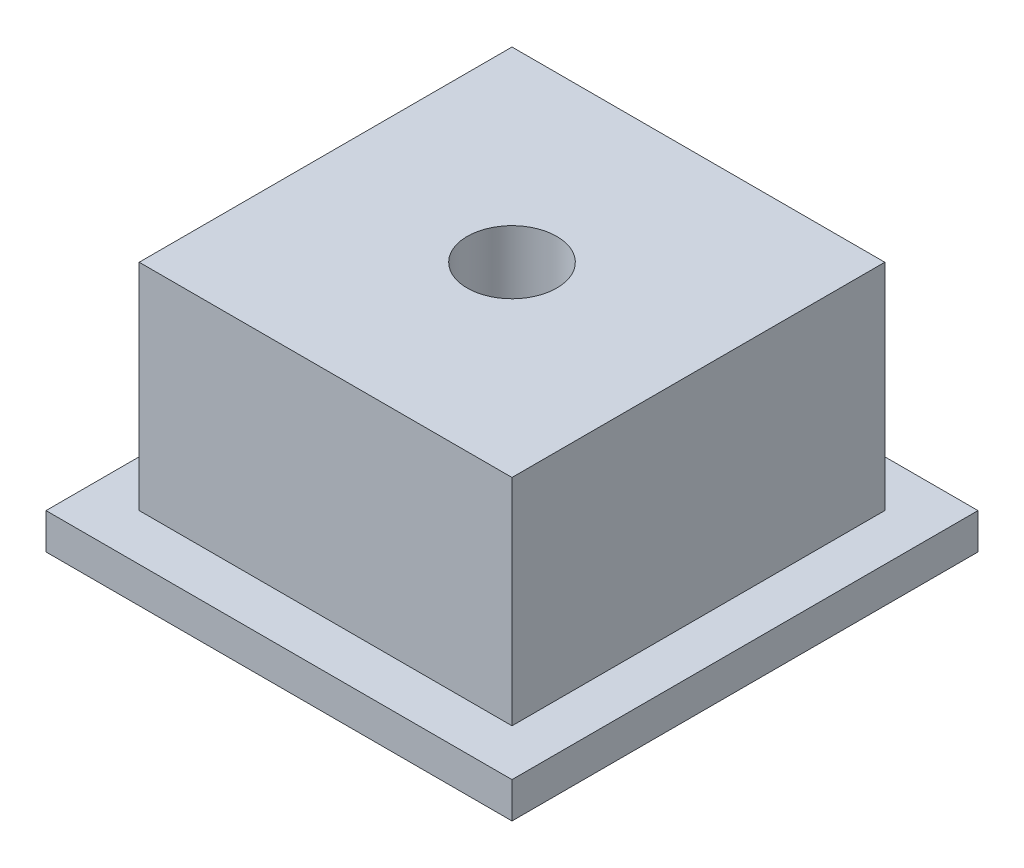
ISO-10303-21;
HEADER;
FILE_DESCRIPTION(('STEP AP214'),'2;1');
FILE_NAME('part.step','',(''),(''),'','','');
FILE_SCHEMA(('AUTOMOTIVE_DESIGN { 1 0 10303 214 1 1 1 1 }'));
ENDSEC;
DATA;
#1=APPLICATION_CONTEXT('core data for automotive mechanical design processes');
#2=APPLICATION_PROTOCOL_DEFINITION('international standard','automotive_design',2000,#1);
#3=PRODUCT_CONTEXT('',#1,'mechanical');
#4=PRODUCT('Part','Part','',(#3));
#5=PRODUCT_RELATED_PRODUCT_CATEGORY('part','',(#4));
#6=PRODUCT_DEFINITION_FORMATION('','',#4);
#7=PRODUCT_DEFINITION_CONTEXT('part definition',#1,'design');
#8=PRODUCT_DEFINITION('design','',#6,#7);
#9=PRODUCT_DEFINITION_SHAPE('','',#8);
#10=(LENGTH_UNIT() NAMED_UNIT(*) SI_UNIT(.MILLI.,.METRE.));
#11=(NAMED_UNIT(*) PLANE_ANGLE_UNIT() SI_UNIT($,.RADIAN.));
#12=(NAMED_UNIT(*) SI_UNIT($,.STERADIAN.) SOLID_ANGLE_UNIT());
#13=UNCERTAINTY_MEASURE_WITH_UNIT(LENGTH_MEASURE(1.E-05),#10,'distance_accuracy_value','');
#14=(GEOMETRIC_REPRESENTATION_CONTEXT(3) GLOBAL_UNCERTAINTY_ASSIGNED_CONTEXT((#13)) GLOBAL_UNIT_ASSIGNED_CONTEXT((#10,
#11,#12)) REPRESENTATION_CONTEXT('',''));
#15=CARTESIAN_POINT('',(0.,0.,0.));
#16=DIRECTION('',(0.,0.,1.));
#17=DIRECTION('',(1.,0.,0.));
#18=AXIS2_PLACEMENT_3D('',#15,#16,#17);
#19=CARTESIAN_POINT('',(0.,1.,0.));
#20=DIRECTION('',(0.,-1.,0.));
#21=DIRECTION('',(0.,0.,-1.));
#22=AXIS2_PLACEMENT_3D('',#19,#20,#21);
#23=PLANE('',#22);
#24=DIRECTION('',(0.,0.,-1.));
#25=VECTOR('',#24,1.);
#26=CARTESIAN_POINT('',(6.5,1.,6.5));
#27=LINE('',#26,#25);
#28=CARTESIAN_POINT('',(6.5,1.,6.5));
#29=VERTEX_POINT('',#28);
#30=CARTESIAN_POINT('',(6.5,1.,-6.5));
#31=VERTEX_POINT('',#30);
#32=EDGE_CURVE('E143',#29,#31,#27,.T.);
#33=ORIENTED_EDGE('',*,*,#32,.T.);
#34=DIRECTION('',(-1.,0.,0.));
#35=VECTOR('',#34,1.);
#36=CARTESIAN_POINT('',(-6.5,1.,-6.5));
#37=LINE('',#36,#35);
#38=CARTESIAN_POINT('',(-6.5,1.,-6.5));
#39=VERTEX_POINT('',#38);
#40=EDGE_CURVE('E147',#31,#39,#37,.T.);
#41=ORIENTED_EDGE('',*,*,#40,.T.);
#42=DIRECTION('',(0.,0.,1.));
#43=VECTOR('',#42,1.);
#44=CARTESIAN_POINT('',(-6.5,1.,6.5));
#45=LINE('',#44,#43);
#46=CARTESIAN_POINT('',(-6.5,1.,6.5));
#47=VERTEX_POINT('',#46);
#48=EDGE_CURVE('E151',#39,#47,#45,.T.);
#49=ORIENTED_EDGE('',*,*,#48,.T.);
#50=DIRECTION('',(1.,0.,0.));
#51=VECTOR('',#50,1.);
#52=CARTESIAN_POINT('',(-6.5,1.,6.5));
#53=LINE('',#52,#51);
#54=EDGE_CURVE('E154',#47,#29,#53,.T.);
#55=ORIENTED_EDGE('',*,*,#54,.T.);
#56=EDGE_LOOP('',(#33,#41,#49,#55));
#57=FACE_BOUND('',#56,.T.);
#58=DIRECTION('',(0.,0.,-1.));
#59=VECTOR('',#58,1.);
#60=CARTESIAN_POINT('',(5.2,1.,5.2));
#61=LINE('',#60,#59);
#62=CARTESIAN_POINT('',(5.2,1.,5.2));
#63=VERTEX_POINT('',#62);
#64=CARTESIAN_POINT('',(5.2,1.,-5.2));
#65=VERTEX_POINT('',#64);
#66=EDGE_CURVE('E59',#63,#65,#61,.T.);
#67=ORIENTED_EDGE('',*,*,#66,.F.);
#68=DIRECTION('',(1.,0.,0.));
#69=VECTOR('',#68,1.);
#70=CARTESIAN_POINT('',(-5.2,1.,5.2));
#71=LINE('',#70,#69);
#72=CARTESIAN_POINT('',(-5.2,1.,5.2));
#73=VERTEX_POINT('',#72);
#74=EDGE_CURVE('E63',#73,#63,#71,.T.);
#75=ORIENTED_EDGE('',*,*,#74,.F.);
#76=DIRECTION('',(0.,0.,1.));
#77=VECTOR('',#76,1.);
#78=CARTESIAN_POINT('',(-5.2,1.,5.2));
#79=LINE('',#78,#77);
#80=CARTESIAN_POINT('',(-5.2,1.,-5.2));
#81=VERTEX_POINT('',#80);
#82=EDGE_CURVE('E373',#81,#73,#79,.T.);
#83=ORIENTED_EDGE('',*,*,#82,.F.);
#84=DIRECTION('',(-1.,0.,0.));
#85=VECTOR('',#84,1.);
#86=CARTESIAN_POINT('',(-5.2,1.,-5.2));
#87=LINE('',#86,#85);
#88=EDGE_CURVE('E370',#65,#81,#87,.T.);
#89=ORIENTED_EDGE('',*,*,#88,.F.);
#90=EDGE_LOOP('',(#67,#75,#83,#89));
#91=FACE_BOUND('',#90,.T.);
#92=ADVANCED_FACE('F43',(#57,#91),#23,.F.);
#93=CARTESIAN_POINT('',(6.5,1.,6.5));
#94=DIRECTION('',(-1.,0.,0.));
#95=DIRECTION('',(0.,0.,1.));
#96=AXIS2_PLACEMENT_3D('',#93,#94,#95);
#97=PLANE('',#96);
#98=DIRECTION('',(0.,0.,-1.));
#99=VECTOR('',#98,1.);
#100=CARTESIAN_POINT('',(6.5,0.,6.5));
#101=LINE('',#100,#99);
#102=CARTESIAN_POINT('',(6.5,0.,6.5));
#103=VERTEX_POINT('',#102);
#104=CARTESIAN_POINT('',(6.5,0.,-6.5));
#105=VERTEX_POINT('',#104);
#106=EDGE_CURVE('E132',#103,#105,#101,.T.);
#107=ORIENTED_EDGE('',*,*,#106,.T.);
#108=DIRECTION('',(0.,-1.,0.));
#109=VECTOR('',#108,1.);
#110=CARTESIAN_POINT('',(6.5,1.,-6.5));
#111=LINE('',#110,#109);
#112=EDGE_CURVE('E11',#31,#105,#111,.T.);
#113=ORIENTED_EDGE('',*,*,#112,.F.);
#114=ORIENTED_EDGE('',*,*,#32,.F.);
#115=DIRECTION('',(0.,-1.,0.));
#116=VECTOR('',#115,1.);
#117=CARTESIAN_POINT('',(6.5,1.,6.5));
#118=LINE('',#117,#116);
#119=EDGE_CURVE('E156',#29,#103,#118,.T.);
#120=ORIENTED_EDGE('',*,*,#119,.T.);
#121=EDGE_LOOP('',(#107,#113,#114,#120));
#122=FACE_BOUND('',#121,.T.);
#123=ADVANCED_FACE('F45',(#122),#97,.F.);
#124=CARTESIAN_POINT('',(-6.5,1.,-6.5));
#125=DIRECTION('',(0.,0.,1.));
#126=DIRECTION('',(1.,0.,0.));
#127=AXIS2_PLACEMENT_3D('',#124,#125,#126);
#128=PLANE('',#127);
#129=DIRECTION('',(-1.,0.,0.));
#130=VECTOR('',#129,1.);
#131=CARTESIAN_POINT('',(-6.5,0.,-6.5));
#132=LINE('',#131,#130);
#133=CARTESIAN_POINT('',(-6.5,0.,-6.5));
#134=VERTEX_POINT('',#133);
#135=EDGE_CURVE('E137',#105,#134,#132,.T.);
#136=ORIENTED_EDGE('',*,*,#135,.T.);
#137=DIRECTION('',(0.,-1.,0.));
#138=VECTOR('',#137,1.);
#139=CARTESIAN_POINT('',(-6.5,1.,-6.5));
#140=LINE('',#139,#138);
#141=EDGE_CURVE('E52',#39,#134,#140,.T.);
#142=ORIENTED_EDGE('',*,*,#141,.F.);
#143=ORIENTED_EDGE('',*,*,#40,.F.);
#144=ORIENTED_EDGE('',*,*,#112,.T.);
#145=EDGE_LOOP('',(#136,#142,#143,#144));
#146=FACE_BOUND('',#145,.T.);
#147=ADVANCED_FACE('F192',(#146),#128,.F.);
#148=CARTESIAN_POINT('',(-6.5,1.,6.5));
#149=DIRECTION('',(1.,0.,0.));
#150=DIRECTION('',(0.,0.,-1.));
#151=AXIS2_PLACEMENT_3D('',#148,#149,#150);
#152=PLANE('',#151);
#153=DIRECTION('',(0.,0.,1.));
#154=VECTOR('',#153,1.);
#155=CARTESIAN_POINT('',(-6.5,0.,6.5));
#156=LINE('',#155,#154);
#157=CARTESIAN_POINT('',(-6.5,0.,6.5));
#158=VERTEX_POINT('',#157);
#159=EDGE_CURVE('E160',#134,#158,#156,.T.);
#160=ORIENTED_EDGE('',*,*,#159,.T.);
#161=DIRECTION('',(0.,-1.,0.));
#162=VECTOR('',#161,1.);
#163=CARTESIAN_POINT('',(-6.5,1.,6.5));
#164=LINE('',#163,#162);
#165=EDGE_CURVE('E168',#47,#158,#164,.T.);
#166=ORIENTED_EDGE('',*,*,#165,.F.);
#167=ORIENTED_EDGE('',*,*,#48,.F.);
#168=ORIENTED_EDGE('',*,*,#141,.T.);
#169=EDGE_LOOP('',(#160,#166,#167,#168));
#170=FACE_BOUND('',#169,.T.);
#171=ADVANCED_FACE('F177',(#170),#152,.F.);
#172=CARTESIAN_POINT('',(-6.5,1.,6.5));
#173=DIRECTION('',(0.,0.,-1.));
#174=DIRECTION('',(-1.,0.,0.));
#175=AXIS2_PLACEMENT_3D('',#172,#173,#174);
#176=PLANE('',#175);
#177=DIRECTION('',(1.,0.,0.));
#178=VECTOR('',#177,1.);
#179=CARTESIAN_POINT('',(-6.5,0.,6.5));
#180=LINE('',#179,#178);
#181=EDGE_CURVE('E148',#158,#103,#180,.T.);
#182=ORIENTED_EDGE('',*,*,#181,.T.);
#183=ORIENTED_EDGE('',*,*,#119,.F.);
#184=ORIENTED_EDGE('',*,*,#54,.F.);
#185=ORIENTED_EDGE('',*,*,#165,.T.);
#186=EDGE_LOOP('',(#182,#183,#184,#185));
#187=FACE_BOUND('',#186,.T.);
#188=ADVANCED_FACE('F186',(#187),#176,.F.);
#189=CARTESIAN_POINT('',(0.,0.,0.));
#190=DIRECTION('',(0.,-1.,0.));
#191=DIRECTION('',(0.,0.,-1.));
#192=AXIS2_PLACEMENT_3D('',#189,#190,#191);
#193=PLANE('',#192);
#194=CARTESIAN_POINT('',(0.,0.,0.));
#195=DIRECTION('',(0.,-1.,0.));
#196=DIRECTION('',(0.,0.,-1.));
#197=AXIS2_PLACEMENT_3D('',#194,#195,#196);
#198=CIRCLE('',#197,4.5);
#199=CARTESIAN_POINT('',(0.,0.,-4.5));
#200=VERTEX_POINT('',#199);
#201=EDGE_CURVE('E353',#200,#200,#198,.T.);
#202=ORIENTED_EDGE('',*,*,#201,.F.);
#203=EDGE_LOOP('',(#202));
#204=FACE_BOUND('',#203,.T.);
#205=ORIENTED_EDGE('',*,*,#106,.F.);
#206=ORIENTED_EDGE('',*,*,#181,.F.);
#207=ORIENTED_EDGE('',*,*,#159,.F.);
#208=ORIENTED_EDGE('',*,*,#135,.F.);
#209=EDGE_LOOP('',(#205,#206,#207,#208));
#210=FACE_BOUND('',#209,.T.);
#211=ADVANCED_FACE('F183',(#204,#210),#193,.T.);
#212=CARTESIAN_POINT('',(5.2,7.,5.2));
#213=DIRECTION('',(-1.,0.,0.));
#214=DIRECTION('',(0.,0.,1.));
#215=AXIS2_PLACEMENT_3D('',#212,#213,#214);
#216=PLANE('',#215);
#217=ORIENTED_EDGE('',*,*,#66,.T.);
#218=DIRECTION('',(0.,-1.,0.));
#219=VECTOR('',#218,1.);
#220=CARTESIAN_POINT('',(5.2,7.,-5.2));
#221=LINE('',#220,#219);
#222=CARTESIAN_POINT('',(5.2,7.,-5.2));
#223=VERTEX_POINT('',#222);
#224=EDGE_CURVE('E112',#223,#65,#221,.T.);
#225=ORIENTED_EDGE('',*,*,#224,.F.);
#226=DIRECTION('',(0.,0.,-1.));
#227=VECTOR('',#226,1.);
#228=CARTESIAN_POINT('',(5.2,7.,5.2));
#229=LINE('',#228,#227);
#230=CARTESIAN_POINT('',(5.2,7.,5.2));
#231=VERTEX_POINT('',#230);
#232=EDGE_CURVE('E119',#231,#223,#229,.T.);
#233=ORIENTED_EDGE('',*,*,#232,.F.);
#234=DIRECTION('',(0.,-1.,0.));
#235=VECTOR('',#234,1.);
#236=CARTESIAN_POINT('',(5.2,7.,5.2));
#237=LINE('',#236,#235);
#238=EDGE_CURVE('E367',#231,#63,#237,.T.);
#239=ORIENTED_EDGE('',*,*,#238,.T.);
#240=EDGE_LOOP('',(#217,#225,#233,#239));
#241=FACE_BOUND('',#240,.T.);
#242=ADVANCED_FACE('F130',(#241),#216,.F.);
#243=CARTESIAN_POINT('',(-5.2,7.,-5.2));
#244=DIRECTION('',(0.,0.,1.));
#245=DIRECTION('',(1.,0.,0.));
#246=AXIS2_PLACEMENT_3D('',#243,#244,#245);
#247=PLANE('',#246);
#248=ORIENTED_EDGE('',*,*,#88,.T.);
#249=DIRECTION('',(0.,-1.,0.));
#250=VECTOR('',#249,1.);
#251=CARTESIAN_POINT('',(-5.2,7.,-5.2));
#252=LINE('',#251,#250);
#253=CARTESIAN_POINT('',(-5.2,7.,-5.2));
#254=VERTEX_POINT('',#253);
#255=EDGE_CURVE('E114',#254,#81,#252,.T.);
#256=ORIENTED_EDGE('',*,*,#255,.F.);
#257=DIRECTION('',(-1.,0.,0.));
#258=VECTOR('',#257,1.);
#259=CARTESIAN_POINT('',(-5.2,7.,-5.2));
#260=LINE('',#259,#258);
#261=EDGE_CURVE('E107',#223,#254,#260,.T.);
#262=ORIENTED_EDGE('',*,*,#261,.F.);
#263=ORIENTED_EDGE('',*,*,#224,.T.);
#264=EDGE_LOOP('',(#248,#256,#262,#263));
#265=FACE_BOUND('',#264,.T.);
#266=ADVANCED_FACE('F110',(#265),#247,.F.);
#267=CARTESIAN_POINT('',(-5.2,7.,5.2));
#268=DIRECTION('',(1.,0.,0.));
#269=DIRECTION('',(0.,0.,-1.));
#270=AXIS2_PLACEMENT_3D('',#267,#268,#269);
#271=PLANE('',#270);
#272=ORIENTED_EDGE('',*,*,#82,.T.);
#273=DIRECTION('',(0.,-1.,0.));
#274=VECTOR('',#273,1.);
#275=CARTESIAN_POINT('',(-5.2,7.,5.2));
#276=LINE('',#275,#274);
#277=CARTESIAN_POINT('',(-5.2,7.,5.2));
#278=VERTEX_POINT('',#277);
#279=EDGE_CURVE('E139',#278,#73,#276,.T.);
#280=ORIENTED_EDGE('',*,*,#279,.F.);
#281=DIRECTION('',(0.,0.,1.));
#282=VECTOR('',#281,1.);
#283=CARTESIAN_POINT('',(-5.2,7.,5.2));
#284=LINE('',#283,#282);
#285=EDGE_CURVE('E118',#254,#278,#284,.T.);
#286=ORIENTED_EDGE('',*,*,#285,.F.);
#287=ORIENTED_EDGE('',*,*,#255,.T.);
#288=EDGE_LOOP('',(#272,#280,#286,#287));
#289=FACE_BOUND('',#288,.T.);
#290=ADVANCED_FACE('F231',(#289),#271,.F.);
#291=CARTESIAN_POINT('',(-5.2,7.,5.2));
#292=DIRECTION('',(0.,0.,-1.));
#293=DIRECTION('',(-1.,0.,0.));
#294=AXIS2_PLACEMENT_3D('',#291,#292,#293);
#295=PLANE('',#294);
#296=ORIENTED_EDGE('',*,*,#74,.T.);
#297=ORIENTED_EDGE('',*,*,#238,.F.);
#298=DIRECTION('',(1.,0.,0.));
#299=VECTOR('',#298,1.);
#300=CARTESIAN_POINT('',(-5.2,7.,5.2));
#301=LINE('',#300,#299);
#302=EDGE_CURVE('E124',#278,#231,#301,.T.);
#303=ORIENTED_EDGE('',*,*,#302,.F.);
#304=ORIENTED_EDGE('',*,*,#279,.T.);
#305=EDGE_LOOP('',(#296,#297,#303,#304));
#306=FACE_BOUND('',#305,.T.);
#307=ADVANCED_FACE('F237',(#306),#295,.F.);
#308=CARTESIAN_POINT('',(0.,7.,0.));
#309=DIRECTION('',(0.,-1.,0.));
#310=DIRECTION('',(0.,0.,-1.));
#311=AXIS2_PLACEMENT_3D('',#308,#309,#310);
#312=PLANE('',#311);
#313=CARTESIAN_POINT('',(0.,7.,0.));
#314=DIRECTION('',(0.,-1.,0.));
#315=DIRECTION('',(0.,0.,-1.));
#316=AXIS2_PLACEMENT_3D('',#313,#314,#315);
#317=CIRCLE('',#316,1.25);
#318=CARTESIAN_POINT('',(0.,7.,-1.25));
#319=VERTEX_POINT('',#318);
#320=EDGE_CURVE('E346',#319,#319,#317,.T.);
#321=ORIENTED_EDGE('',*,*,#320,.T.);
#322=EDGE_LOOP('',(#321));
#323=FACE_BOUND('',#322,.T.);
#324=ORIENTED_EDGE('',*,*,#232,.T.);
#325=ORIENTED_EDGE('',*,*,#261,.T.);
#326=ORIENTED_EDGE('',*,*,#285,.T.);
#327=ORIENTED_EDGE('',*,*,#302,.T.);
#328=EDGE_LOOP('',(#324,#325,#326,#327));
#329=FACE_BOUND('',#328,.T.);
#330=ADVANCED_FACE('F122',(#323,#329),#312,.F.);
#331=CARTESIAN_POINT('',(0.,4.,0.));
#332=DIRECTION('',(0.,-1.,0.));
#333=DIRECTION('',(0.,0.,-1.));
#334=AXIS2_PLACEMENT_3D('',#331,#332,#333);
#335=CYLINDRICAL_SURFACE('',#334,4.5);
#336=CARTESIAN_POINT('',(0.,4.,0.));
#337=DIRECTION('',(0.,-1.,0.));
#338=DIRECTION('',(0.,0.,-1.));
#339=AXIS2_PLACEMENT_3D('',#336,#337,#338);
#340=CIRCLE('',#339,4.5);
#341=CARTESIAN_POINT('',(0.,4.,-4.5));
#342=VERTEX_POINT('',#341);
#343=EDGE_CURVE('E356',#342,#342,#340,.T.);
#344=ORIENTED_EDGE('',*,*,#343,.F.);
#345=EDGE_LOOP('',(#344));
#346=FACE_BOUND('',#345,.T.);
#347=ORIENTED_EDGE('',*,*,#201,.T.);
#348=EDGE_LOOP('',(#347));
#349=FACE_BOUND('',#348,.T.);
#350=ADVANCED_FACE('F251',(#346,#349),#335,.F.);
#351=CARTESIAN_POINT('',(0.,4.,0.));
#352=DIRECTION('',(0.,-1.,0.));
#353=DIRECTION('',(0.,0.,-1.));
#354=AXIS2_PLACEMENT_3D('',#351,#352,#353);
#355=PLANE('',#354);
#356=CARTESIAN_POINT('',(0.,4.,0.));
#357=DIRECTION('',(0.,-1.,0.));
#358=DIRECTION('',(0.,0.,-1.));
#359=AXIS2_PLACEMENT_3D('',#356,#357,#358);
#360=CIRCLE('',#359,1.25);
#361=CARTESIAN_POINT('',(0.,4.,-1.25));
#362=VERTEX_POINT('',#361);
#363=EDGE_CURVE('E349',#362,#362,#360,.T.);
#364=ORIENTED_EDGE('',*,*,#363,.F.);
#365=EDGE_LOOP('',(#364));
#366=FACE_BOUND('',#365,.T.);
#367=ORIENTED_EDGE('',*,*,#343,.T.);
#368=EDGE_LOOP('',(#367));
#369=FACE_BOUND('',#368,.T.);
#370=ADVANCED_FACE('F259',(#366,#369),#355,.T.);
#371=CARTESIAN_POINT('',(0.,7.,0.));
#372=DIRECTION('',(0.,-1.,0.));
#373=DIRECTION('',(0.,0.,-1.));
#374=AXIS2_PLACEMENT_3D('',#371,#372,#373);
#375=CYLINDRICAL_SURFACE('',#374,1.25);
#376=ORIENTED_EDGE('',*,*,#320,.F.);
#377=EDGE_LOOP('',(#376));
#378=FACE_BOUND('',#377,.T.);
#379=ORIENTED_EDGE('',*,*,#363,.T.);
#380=EDGE_LOOP('',(#379));
#381=FACE_BOUND('',#380,.T.);
#382=ADVANCED_FACE('F266',(#378,#381),#375,.F.);
#383=CLOSED_SHELL('',(#92,#123,#147,#171,#188,#211,#242,#266,#290,#307,#330,#350,#370,#382));
#384=MANIFOLD_SOLID_BREP('B2',#383);
#385=ADVANCED_BREP_SHAPE_REPRESENTATION('',(#18,#384),#14);
#386=SHAPE_DEFINITION_REPRESENTATION(#9,#385);
ENDSEC;
END-ISO-10303-21;
